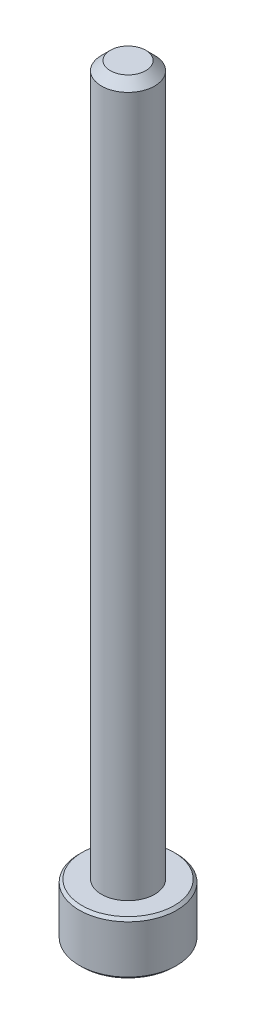
ISO-10303-21;
HEADER;
FILE_DESCRIPTION(('STEP AP214'),'2;1');
FILE_NAME('part.step','',(''),(''),'','','');
FILE_SCHEMA(('AUTOMOTIVE_DESIGN { 1 0 10303 214 1 1 1 1 }'));
ENDSEC;
DATA;
#1=APPLICATION_CONTEXT('core data for automotive mechanical design processes');
#2=APPLICATION_PROTOCOL_DEFINITION('international standard','automotive_design',2000,#1);
#3=PRODUCT_CONTEXT('',#1,'mechanical');
#4=PRODUCT('Part','Part','',(#3));
#5=PRODUCT_RELATED_PRODUCT_CATEGORY('part','',(#4));
#6=PRODUCT_DEFINITION_FORMATION('','',#4);
#7=PRODUCT_DEFINITION_CONTEXT('part definition',#1,'design');
#8=PRODUCT_DEFINITION('design','',#6,#7);
#9=PRODUCT_DEFINITION_SHAPE('','',#8);
#10=(LENGTH_UNIT() NAMED_UNIT(*) SI_UNIT(.MILLI.,.METRE.));
#11=(NAMED_UNIT(*) PLANE_ANGLE_UNIT() SI_UNIT($,.RADIAN.));
#12=(NAMED_UNIT(*) SI_UNIT($,.STERADIAN.) SOLID_ANGLE_UNIT());
#13=UNCERTAINTY_MEASURE_WITH_UNIT(LENGTH_MEASURE(1.E-05),#10,'distance_accuracy_value','');
#14=(GEOMETRIC_REPRESENTATION_CONTEXT(3) GLOBAL_UNCERTAINTY_ASSIGNED_CONTEXT((#13)) GLOBAL_UNIT_ASSIGNED_CONTEXT((#10,
#11,#12)) REPRESENTATION_CONTEXT('',''));
#15=CARTESIAN_POINT('',(0.,0.,0.));
#16=DIRECTION('',(0.,0.,1.));
#17=DIRECTION('',(1.,0.,0.));
#18=AXIS2_PLACEMENT_3D('',#15,#16,#17);
#19=CARTESIAN_POINT('',(9.23760430703373,44.999999906,16.));
#20=DIRECTION('',(0.,-1.,0.));
#21=DIRECTION('',(0.785714285714293,0.,-0.618589574131732));
#22=AXIS2_PLACEMENT_3D('',#19,#20,#21);
#23=CONICAL_SURFACE('',#22,1.,0.785398163397443);
#24=CARTESIAN_POINT('',(9.23760430703373,44.999999906,16.));
#25=DIRECTION('',(0.,1.,0.));
#26=DIRECTION('',(-0.785714285714293,0.,0.618589574131732));
#27=AXIS2_PLACEMENT_3D('',#24,#25,#26);
#28=CIRCLE('',#27,1.);
#29=CARTESIAN_POINT('',(8.45189002131944,44.999999906,16.6185895741317));
#30=VERTEX_POINT('',#29);
#31=EDGE_CURVE('E570',#30,#30,#28,.T.);
#32=ORIENTED_EDGE('',*,*,#31,.F.);
#33=EDGE_LOOP('',(#32));
#34=FACE_BOUND('',#33,.T.);
#35=CARTESIAN_POINT('',(9.23760430703373,44.499999906,16.));
#36=DIRECTION('',(0.,1.,0.));
#37=DIRECTION('',(-0.785714285714293,0.,0.618589574131732));
#38=AXIS2_PLACEMENT_3D('',#35,#36,#37);
#39=CIRCLE('',#38,1.5);
#40=CARTESIAN_POINT('',(8.05903287846229,44.499999906,16.9278843611976));
#41=VERTEX_POINT('',#40);
#42=EDGE_CURVE('E11',#41,#41,#39,.T.);
#43=ORIENTED_EDGE('',*,*,#42,.T.);
#44=EDGE_LOOP('',(#43));
#45=FACE_BOUND('',#44,.T.);
#46=ADVANCED_FACE('F16',(#34,#45),#23,.T.);
#47=CARTESIAN_POINT('',(9.23760430703373,44.999999906,16.));
#48=DIRECTION('',(0.,1.,0.));
#49=DIRECTION('',(-0.785714285714293,0.,0.618589574131732));
#50=AXIS2_PLACEMENT_3D('',#47,#48,#49);
#51=CYLINDRICAL_SURFACE('',#50,1.5);
#52=CARTESIAN_POINT('',(9.23760430703372,4.999999906,16.));
#53=DIRECTION('',(0.,1.,0.));
#54=DIRECTION('',(-0.785714285714293,0.,0.618589574131732));
#55=AXIS2_PLACEMENT_3D('',#52,#53,#54);
#56=CIRCLE('',#55,1.5);
#57=CARTESIAN_POINT('',(8.05903287846228,4.999999906,16.9278843611976));
#58=VERTEX_POINT('',#57);
#59=EDGE_CURVE('E566',#58,#58,#56,.T.);
#60=ORIENTED_EDGE('',*,*,#59,.T.);
#61=EDGE_LOOP('',(#60));
#62=FACE_BOUND('',#61,.T.);
#63=ORIENTED_EDGE('',*,*,#42,.F.);
#64=EDGE_LOOP('',(#63));
#65=FACE_BOUND('',#64,.T.);
#66=ADVANCED_FACE('F220',(#62,#65),#51,.T.);
#67=CARTESIAN_POINT('',(9.23760430703372,4.999999906,16.));
#68=DIRECTION('',(0.,-1.,0.));
#69=DIRECTION('',(0.785714285714293,0.,-0.618589574131732));
#70=AXIS2_PLACEMENT_3D('',#67,#68,#69);
#71=CONICAL_SURFACE('',#70,2.6,0.78539816339746);
#72=CARTESIAN_POINT('',(9.23760430703372,4.999999906,16.));
#73=DIRECTION('',(0.,1.,0.));
#74=DIRECTION('',(-0.785714285714293,0.,0.618589574131732));
#75=AXIS2_PLACEMENT_3D('',#72,#73,#74);
#76=CIRCLE('',#75,2.6);
#77=CARTESIAN_POINT('',(7.19474716417656,4.999999906,17.6083328927425));
#78=VERTEX_POINT('',#77);
#79=EDGE_CURVE('E562',#78,#78,#76,.T.);
#80=ORIENTED_EDGE('',*,*,#79,.F.);
#81=EDGE_LOOP('',(#80));
#82=FACE_BOUND('',#81,.T.);
#83=CARTESIAN_POINT('',(9.23760430703372,4.849999906,16.));
#84=DIRECTION('',(0.,1.,0.));
#85=DIRECTION('',(-0.785714285714293,0.,0.618589574131732));
#86=AXIS2_PLACEMENT_3D('',#83,#84,#85);
#87=CIRCLE('',#86,2.75);
#88=CARTESIAN_POINT('',(7.07689002131942,4.849999906,17.7011213288623));
#89=VERTEX_POINT('',#88);
#90=EDGE_CURVE('E28',#89,#89,#87,.T.);
#91=ORIENTED_EDGE('',*,*,#90,.T.);
#92=EDGE_LOOP('',(#91));
#93=FACE_BOUND('',#92,.T.);
#94=ADVANCED_FACE('F18',(#82,#93),#71,.T.);
#95=CARTESIAN_POINT('',(9.23760430703373,44.999999906,16.));
#96=DIRECTION('',(0.,1.,0.));
#97=DIRECTION('',(-0.785714285714293,0.,0.618589574131732));
#98=AXIS2_PLACEMENT_3D('',#95,#96,#97);
#99=CYLINDRICAL_SURFACE('',#98,2.75);
#100=CARTESIAN_POINT('',(9.23760430703372,2.149999906,16.));
#101=DIRECTION('',(0.,1.,0.));
#102=DIRECTION('',(-0.785714285714293,0.,0.618589574131732));
#103=AXIS2_PLACEMENT_3D('',#100,#101,#102);
#104=CIRCLE('',#103,2.75);
#105=CARTESIAN_POINT('',(7.07689002131942,2.149999906,17.7011213288623));
#106=VERTEX_POINT('',#105);
#107=EDGE_CURVE('E554',#106,#106,#104,.T.);
#108=ORIENTED_EDGE('',*,*,#107,.T.);
#109=EDGE_LOOP('',(#108));
#110=FACE_BOUND('',#109,.T.);
#111=ORIENTED_EDGE('',*,*,#90,.F.);
#112=EDGE_LOOP('',(#111));
#113=FACE_BOUND('',#112,.T.);
#114=ADVANCED_FACE('F224',(#110,#113),#99,.T.);
#115=CARTESIAN_POINT('',(9.23760430703372,2.149999906,16.));
#116=DIRECTION('',(0.,1.,0.));
#117=DIRECTION('',(-0.785714285714293,0.,0.618589574131732));
#118=AXIS2_PLACEMENT_3D('',#115,#116,#117);
#119=CONICAL_SURFACE('',#118,2.75,0.785398163397435);
#120=CARTESIAN_POINT('',(9.23760430703372,1.99999990599999,16.));
#121=DIRECTION('',(0.,1.,0.));
#122=DIRECTION('',(-0.785714285714293,0.,0.618589574131732));
#123=AXIS2_PLACEMENT_3D('',#120,#121,#122);
#124=CIRCLE('',#123,2.6);
#125=CARTESIAN_POINT('',(7.19474716417656,1.999999906,17.6083328927425));
#126=VERTEX_POINT('',#125);
#127=EDGE_CURVE('E558',#126,#126,#124,.T.);
#128=ORIENTED_EDGE('',*,*,#127,.T.);
#129=EDGE_LOOP('',(#128));
#130=FACE_BOUND('',#129,.T.);
#131=ORIENTED_EDGE('',*,*,#107,.F.);
#132=EDGE_LOOP('',(#131));
#133=FACE_BOUND('',#132,.T.);
#134=ADVANCED_FACE('F222',(#130,#133),#119,.T.);
#135=CARTESIAN_POINT('',(10.8459371997762,1.99999990599999,18.0428571428571));
#136=DIRECTION('',(0.,-1.,0.));
#137=DIRECTION('',(-1.,0.,0.));
#138=AXIS2_PLACEMENT_3D('',#135,#136,#137);
#139=PLANE('',#138);
#140=CARTESIAN_POINT('',(9.23760430703372,1.99999990599999,16.));
#141=DIRECTION('',(0.,-1.,0.));
#142=DIRECTION('',(0.785714285714293,0.,-0.618589574131732));
#143=AXIS2_PLACEMENT_3D('',#140,#141,#142);
#144=CIRCLE('',#143,1.44337567297406);
#145=CARTESIAN_POINT('',(10.3716851929419,1.99999990599999,15.1071428571429));
#146=VERTEX_POINT('',#145);
#147=CARTESIAN_POINT('',(10.5778817176525,1.99999990599999,16.5357142857143));
#148=VERTEX_POINT('',#147);
#149=EDGE_CURVE('E317',#146,#148,#144,.T.);
#150=ORIENTED_EDGE('',*,*,#149,.F.);
#151=CARTESIAN_POINT('',(9.23760430703372,1.99999990599999,16.));
#152=DIRECTION('',(0.,-1.,0.));
#153=DIRECTION('',(0.785714285714293,0.,-0.618589574131732));
#154=AXIS2_PLACEMENT_3D('',#151,#152,#153);
#155=CIRCLE('',#154,1.44337567297406);
#156=CARTESIAN_POINT('',(9.03140778232316,1.99999990599999,14.5714285714286));
#157=VERTEX_POINT('',#156);
#158=EDGE_CURVE('E133',#157,#146,#155,.T.);
#159=ORIENTED_EDGE('',*,*,#158,.F.);
#160=CARTESIAN_POINT('',(9.23760430703372,1.99999990599999,16.));
#161=DIRECTION('',(0.,-1.,0.));
#162=DIRECTION('',(0.785714285714293,0.,-0.618589574131732));
#163=AXIS2_PLACEMENT_3D('',#160,#161,#162);
#164=CIRCLE('',#163,1.44337567297406);
#165=CARTESIAN_POINT('',(7.89732689641495,1.99999990599999,15.4642857142857));
#166=VERTEX_POINT('',#165);
#167=EDGE_CURVE('E127',#166,#157,#164,.T.);
#168=ORIENTED_EDGE('',*,*,#167,.F.);
#169=CARTESIAN_POINT('',(9.23760430703372,1.99999990599999,16.));
#170=DIRECTION('',(0.,-1.,0.));
#171=DIRECTION('',(0.785714285714293,0.,-0.618589574131732));
#172=AXIS2_PLACEMENT_3D('',#169,#170,#171);
#173=CIRCLE('',#172,1.44337567297406);
#174=CARTESIAN_POINT('',(8.10352342112552,1.99999990599999,16.8928571428571));
#175=VERTEX_POINT('',#174);
#176=EDGE_CURVE('E115',#175,#166,#173,.T.);
#177=ORIENTED_EDGE('',*,*,#176,.F.);
#178=CARTESIAN_POINT('',(9.23760430703372,1.99999990599999,16.));
#179=DIRECTION('',(0.,-1.,0.));
#180=DIRECTION('',(0.785714285714293,0.,-0.618589574131732));
#181=AXIS2_PLACEMENT_3D('',#178,#179,#180);
#182=CIRCLE('',#181,1.44337567297406);
#183=CARTESIAN_POINT('',(9.44380083174429,1.99999990599999,17.4285714285714));
#184=VERTEX_POINT('',#183);
#185=EDGE_CURVE('E126',#184,#175,#182,.T.);
#186=ORIENTED_EDGE('',*,*,#185,.F.);
#187=CARTESIAN_POINT('',(9.23760430703372,1.99999990599999,16.));
#188=DIRECTION('',(0.,-1.,0.));
#189=DIRECTION('',(0.785714285714293,0.,-0.618589574131732));
#190=AXIS2_PLACEMENT_3D('',#187,#188,#189);
#191=CIRCLE('',#190,1.44337567297406);
#192=EDGE_CURVE('E340',#148,#184,#191,.T.);
#193=ORIENTED_EDGE('',*,*,#192,.F.);
#194=EDGE_LOOP('',(#150,#159,#168,#177,#186,#193));
#195=FACE_BOUND('',#194,.T.);
#196=ORIENTED_EDGE('',*,*,#127,.F.);
#197=EDGE_LOOP('',(#196));
#198=FACE_BOUND('',#197,.T.);
#199=ADVANCED_FACE('F131',(#195,#198),#139,.T.);
#200=CARTESIAN_POINT('',(10.8459371997762,4.999999906,18.0428571428571));
#201=DIRECTION('',(0.,1.,0.));
#202=DIRECTION('',(1.,0.,0.));
#203=AXIS2_PLACEMENT_3D('',#200,#201,#202);
#204=PLANE('',#203);
#205=ORIENTED_EDGE('',*,*,#79,.T.);
#206=EDGE_LOOP('',(#205));
#207=FACE_BOUND('',#206,.T.);
#208=ORIENTED_EDGE('',*,*,#59,.F.);
#209=EDGE_LOOP('',(#208));
#210=FACE_BOUND('',#209,.T.);
#211=ADVANCED_FACE('F253',(#207,#210),#204,.T.);
#212=CARTESIAN_POINT('',(9.85619388116546,44.999999906,16.7857142857143));
#213=DIRECTION('',(0.,1.,0.));
#214=DIRECTION('',(1.,0.,0.));
#215=AXIS2_PLACEMENT_3D('',#212,#213,#214);
#216=PLANE('',#215);
#217=ORIENTED_EDGE('',*,*,#31,.T.);
#218=EDGE_LOOP('',(#217));
#219=FACE_BOUND('',#218,.T.);
#220=ADVANCED_FACE('F256',(#219),#216,.T.);
#221=CARTESIAN_POINT('',(9.23760430703372,1.99999990599999,16.));
#222=DIRECTION('',(0.,-1.,0.));
#223=DIRECTION('',(0.785714285714293,0.,-0.618589574131732));
#224=AXIS2_PLACEMENT_3D('',#221,#222,#223);
#225=CONICAL_SURFACE('',#224,1.44337567297406,0.78539816339745);
#226=ORIENTED_EDGE('',*,*,#192,.T.);
#227=CARTESIAN_POINT('',(10.5778817176525,1.99999990599999,16.5357142857143));
#228=CARTESIAN_POINT('',(10.2745979971004,2.19299863726044,16.774488291671));
#229=CARTESIAN_POINT('',(10.0129284441921,2.19337275639812,16.9804996373215));
#230=CARTESIAN_POINT('',(9.74826707710684,2.19375115304891,17.1888664257725));
#231=CARTESIAN_POINT('',(9.4438008317443,1.99999990599999,17.4285714285714));
#232=B_SPLINE_CURVE_WITH_KNOTS('',2,(#227,#228,#229,#230,#231),.UNSPECIFIED.,.F.,.F.,(3,2,3),
(0.,0.5,1.),.UNSPECIFIED.);
#233=EDGE_CURVE('E586',#148,#184,#232,.T.);
#234=ORIENTED_EDGE('',*,*,#233,.F.);
#235=EDGE_LOOP('',(#226,#234));
#236=FACE_BOUND('',#235,.T.);
#237=ADVANCED_FACE('F244',(#236),#225,.F.);
#238=CARTESIAN_POINT('',(9.23760430703372,1.99999990599999,16.));
#239=DIRECTION('',(0.,-1.,0.));
#240=DIRECTION('',(0.785714285714293,0.,-0.618589574131732));
#241=AXIS2_PLACEMENT_3D('',#238,#239,#240);
#242=CONICAL_SURFACE('',#241,1.44337567297406,0.78539816339745);
#243=ORIENTED_EDGE('',*,*,#185,.T.);
#244=CARTESIAN_POINT('',(9.44380083174428,1.99999990599999,17.4285714285714));
#245=CARTESIAN_POINT('',(9.08537461654586,2.19299863726071,17.2853070249972));
#246=CARTESIAN_POINT('',(8.77612878129111,2.19337275639811,17.1617002176071));
#247=CARTESIAN_POINT('',(8.46334716564438,2.19375115304862,17.0366801445363));
#248=CARTESIAN_POINT('',(8.10352342112552,1.99999990599999,16.8928571428571));
#249=B_SPLINE_CURVE_WITH_KNOTS('',2,(#244,#245,#246,#247,#248),.UNSPECIFIED.,.F.,.F.,(3,2,3),
(0.,0.5,1.),.UNSPECIFIED.);
#250=EDGE_CURVE('E346',#184,#175,#249,.T.);
#251=ORIENTED_EDGE('',*,*,#250,.F.);
#252=EDGE_LOOP('',(#243,#251));
#253=FACE_BOUND('',#252,.T.);
#254=ADVANCED_FACE('F219',(#253),#242,.F.);
#255=CARTESIAN_POINT('',(9.23760430703372,1.99999990599999,16.));
#256=DIRECTION('',(0.,-1.,0.));
#257=DIRECTION('',(0.785714285714293,0.,-0.618589574131732));
#258=AXIS2_PLACEMENT_3D('',#255,#256,#257);
#259=CONICAL_SURFACE('',#258,1.44337567297406,0.78539816339745);
#260=ORIENTED_EDGE('',*,*,#176,.T.);
#261=CARTESIAN_POINT('',(8.10352342112552,1.99999990599999,16.8928571428571));
#262=CARTESIAN_POINT('',(8.04838092647953,2.192998637261,16.5108187333253));
#263=CARTESIAN_POINT('',(8.00080464413273,2.19337275639813,16.1812005802857));
#264=CARTESIAN_POINT('',(7.95268439557162,2.19375115304835,15.8478137187629));
#265=CARTESIAN_POINT('',(7.89732689641496,1.99999990599999,15.4642857142857));
#266=B_SPLINE_CURVE_WITH_KNOTS('',2,(#261,#262,#263,#264,#265),.UNSPECIFIED.,.F.,.F.,(3,2,3),
(0.,0.5,1.),.UNSPECIFIED.);
#267=EDGE_CURVE('E119',#175,#166,#266,.T.);
#268=ORIENTED_EDGE('',*,*,#267,.F.);
#269=EDGE_LOOP('',(#260,#268));
#270=FACE_BOUND('',#269,.T.);
#271=ADVANCED_FACE('F117',(#270),#259,.F.);
#272=CARTESIAN_POINT('',(9.23760430703372,1.99999990599999,16.));
#273=DIRECTION('',(0.,-1.,0.));
#274=DIRECTION('',(0.785714285714293,0.,-0.618589574131732));
#275=AXIS2_PLACEMENT_3D('',#272,#273,#274);
#276=CONICAL_SURFACE('',#275,1.44337567297406,0.78539816339745);
#277=ORIENTED_EDGE('',*,*,#167,.T.);
#278=CARTESIAN_POINT('',(7.89732689641495,1.999999906,15.4642857142857));
#279=CARTESIAN_POINT('',(8.20061061696754,2.19299863726072,15.2255117083286));
#280=CARTESIAN_POINT('',(8.46228016987534,2.19337275639814,15.0195003626785));
#281=CARTESIAN_POINT('',(8.72694153696104,2.19375115304864,14.8111335742272));
#282=CARTESIAN_POINT('',(9.03140778232314,1.999999906,14.5714285714286));
#283=B_SPLINE_CURVE_WITH_KNOTS('',2,(#278,#279,#280,#281,#282),.UNSPECIFIED.,.F.,.F.,(3,2,3),
(0.,0.5,1.),.UNSPECIFIED.);
#284=EDGE_CURVE('E152',#166,#157,#283,.T.);
#285=ORIENTED_EDGE('',*,*,#284,.F.);
#286=EDGE_LOOP('',(#277,#285));
#287=FACE_BOUND('',#286,.T.);
#288=ADVANCED_FACE('F154',(#287),#276,.F.);
#289=CARTESIAN_POINT('',(9.23760430703372,1.99999990599999,16.));
#290=DIRECTION('',(0.,-1.,0.));
#291=DIRECTION('',(0.785714285714293,0.,-0.618589574131732));
#292=AXIS2_PLACEMENT_3D('',#289,#290,#291);
#293=CONICAL_SURFACE('',#292,1.44337567297406,0.78539816339745);
#294=ORIENTED_EDGE('',*,*,#158,.T.);
#295=CARTESIAN_POINT('',(9.03140778232316,1.99999990599999,14.5714285714286));
#296=CARTESIAN_POINT('',(9.38983399752165,2.19299863726073,14.7146929750029));
#297=CARTESIAN_POINT('',(9.69907983277633,2.19337275639814,14.8382997823929));
#298=CARTESIAN_POINT('',(10.011861448423,2.19375115304864,14.9633198554637));
#299=CARTESIAN_POINT('',(10.3716851929419,1.99999990599999,15.1071428571429));
#300=B_SPLINE_CURVE_WITH_KNOTS('',2,(#295,#296,#297,#298,#299),.UNSPECIFIED.,.F.,.F.,(3,2,3),
(0.,0.5,1.),.UNSPECIFIED.);
#301=EDGE_CURVE('E172',#157,#146,#300,.T.);
#302=ORIENTED_EDGE('',*,*,#301,.F.);
#303=EDGE_LOOP('',(#294,#302));
#304=FACE_BOUND('',#303,.T.);
#305=ADVANCED_FACE('F263',(#304),#293,.F.);
#306=CARTESIAN_POINT('',(9.23760430703372,1.99999990599999,16.));
#307=DIRECTION('',(0.,-1.,0.));
#308=DIRECTION('',(0.785714285714293,0.,-0.618589574131732));
#309=AXIS2_PLACEMENT_3D('',#306,#307,#308);
#310=CONICAL_SURFACE('',#309,1.44337567297406,0.78539816339745);
#311=ORIENTED_EDGE('',*,*,#149,.T.);
#312=CARTESIAN_POINT('',(10.3716851929419,1.99999990599999,15.1071428571429));
#313=CARTESIAN_POINT('',(10.4268276875877,2.19299863726046,15.4891812666737));
#314=CARTESIAN_POINT('',(10.4744039699347,2.19337275639814,15.8187994197143));
#315=CARTESIAN_POINT('',(10.5225242184956,2.19375115304892,16.152186281236));
#316=CARTESIAN_POINT('',(10.5778817176525,1.99999990599999,16.5357142857143));
#317=B_SPLINE_CURVE_WITH_KNOTS('',2,(#312,#313,#314,#315,#316),.UNSPECIFIED.,.F.,.F.,(3,2,3),
(0.,0.5,1.),.UNSPECIFIED.);
#318=EDGE_CURVE('E284',#146,#148,#317,.T.);
#319=ORIENTED_EDGE('',*,*,#318,.F.);
#320=EDGE_LOOP('',(#311,#319));
#321=FACE_BOUND('',#320,.T.);
#322=ADVANCED_FACE('F251',(#321),#310,.F.);
#323=CARTESIAN_POINT('',(10.8459371997762,3.499999906,18.0428571428571));
#324=DIRECTION('',(0.,-1.,0.));
#325=DIRECTION('',(-1.,0.,0.));
#326=AXIS2_PLACEMENT_3D('',#323,#324,#325);
#327=PLANE('',#326);
#328=DIRECTION('',(-0.142857142857131,0.,-0.989743318610789));
#329=VECTOR('',#328,1.);
#330=CARTESIAN_POINT('',(10.3716851929419,3.499999906,15.1071428571429));
#331=LINE('',#330,#329);
#332=CARTESIAN_POINT('',(10.5778817176525,3.499999906,16.5357142857143));
#333=VERTEX_POINT('',#332);
#334=CARTESIAN_POINT('',(10.3716851929419,3.499999906,15.1071428571429));
#335=VERTEX_POINT('',#334);
#336=EDGE_CURVE('E309',#333,#335,#331,.T.);
#337=ORIENTED_EDGE('',*,*,#336,.F.);
#338=DIRECTION('',(0.785714285714293,0.,-0.618589574131732));
#339=VECTOR('',#338,1.);
#340=CARTESIAN_POINT('',(10.5778817176525,3.499999906,16.5357142857143));
#341=LINE('',#340,#339);
#342=CARTESIAN_POINT('',(9.44380083174428,3.499999906,17.4285714285714));
#343=VERTEX_POINT('',#342);
#344=EDGE_CURVE('E583',#343,#333,#341,.T.);
#345=ORIENTED_EDGE('',*,*,#344,.F.);
#346=DIRECTION('',(0.928571428571424,0.,0.371153744479057));
#347=VECTOR('',#346,1.);
#348=CARTESIAN_POINT('',(9.44380083174428,3.499999906,17.4285714285714));
#349=LINE('',#348,#347);
#350=CARTESIAN_POINT('',(8.10352342112552,3.499999906,16.8928571428571));
#351=VERTEX_POINT('',#350);
#352=EDGE_CURVE('E590',#351,#343,#349,.T.);
#353=ORIENTED_EDGE('',*,*,#352,.F.);
#354=DIRECTION('',(0.142857142857131,0.,0.989743318610789));
#355=VECTOR('',#354,1.);
#356=CARTESIAN_POINT('',(8.10352342112552,3.499999906,16.8928571428571));
#357=LINE('',#356,#355);
#358=CARTESIAN_POINT('',(7.89732689641495,3.499999906,15.4642857142857));
#359=VERTEX_POINT('',#358);
#360=EDGE_CURVE('E149',#359,#351,#357,.T.);
#361=ORIENTED_EDGE('',*,*,#360,.F.);
#362=DIRECTION('',(-0.785714285714293,0.,0.618589574131732));
#363=VECTOR('',#362,1.);
#364=CARTESIAN_POINT('',(7.89732689641495,3.499999906,15.4642857142857));
#365=LINE('',#364,#363);
#366=CARTESIAN_POINT('',(9.03140778232316,3.499999906,14.5714285714286));
#367=VERTEX_POINT('',#366);
#368=EDGE_CURVE('E160',#367,#359,#365,.T.);
#369=ORIENTED_EDGE('',*,*,#368,.F.);
#370=DIRECTION('',(-0.928571428571424,0.,-0.371153744479057));
#371=VECTOR('',#370,1.);
#372=CARTESIAN_POINT('',(9.03140778232316,3.499999906,14.5714285714286));
#373=LINE('',#372,#371);
#374=EDGE_CURVE('E166',#335,#367,#373,.T.);
#375=ORIENTED_EDGE('',*,*,#374,.F.);
#376=EDGE_LOOP('',(#337,#345,#353,#361,#369,#375));
#377=FACE_BOUND('',#376,.T.);
#378=ADVANCED_FACE('F247',(#377),#327,.T.);
#379=CARTESIAN_POINT('',(10.5778817176525,8.81881298512988,16.5357142857143));
#380=DIRECTION('',(0.618589574131732,0.,0.785714285714293));
#381=DIRECTION('',(0.,-1.,0.));
#382=AXIS2_PLACEMENT_3D('',#379,#380,#381);
#383=PLANE('',#382);
#384=DIRECTION('',(0.,-1.,0.));
#385=VECTOR('',#384,1.);
#386=CARTESIAN_POINT('',(10.5778817176525,8.81881298512988,16.5357142857143));
#387=LINE('',#386,#385);
#388=EDGE_CURVE('E320',#333,#148,#387,.T.);
#389=ORIENTED_EDGE('',*,*,#388,.T.);
#390=ORIENTED_EDGE('',*,*,#233,.T.);
#391=DIRECTION('',(0.,-1.,0.));
#392=VECTOR('',#391,1.);
#393=CARTESIAN_POINT('',(9.44380083174429,8.81881298512988,17.4285714285714));
#394=LINE('',#393,#392);
#395=EDGE_CURVE('E343',#343,#184,#394,.T.);
#396=ORIENTED_EDGE('',*,*,#395,.F.);
#397=ORIENTED_EDGE('',*,*,#344,.T.);
#398=EDGE_LOOP('',(#389,#390,#396,#397));
#399=FACE_BOUND('',#398,.T.);
#400=ADVANCED_FACE('F250',(#399),#383,.F.);
#401=CARTESIAN_POINT('',(9.44380083174429,8.81881298512988,17.4285714285714));
#402=DIRECTION('',(-0.371153744479057,0.,0.928571428571424));
#403=DIRECTION('',(0.,1.,0.));
#404=AXIS2_PLACEMENT_3D('',#401,#402,#403);
#405=PLANE('',#404);
#406=ORIENTED_EDGE('',*,*,#395,.T.);
#407=ORIENTED_EDGE('',*,*,#250,.T.);
#408=DIRECTION('',(0.,-1.,0.));
#409=VECTOR('',#408,1.);
#410=CARTESIAN_POINT('',(8.10352342112552,8.81881298512988,16.8928571428571));
#411=LINE('',#410,#409);
#412=EDGE_CURVE('E147',#351,#175,#411,.T.);
#413=ORIENTED_EDGE('',*,*,#412,.F.);
#414=ORIENTED_EDGE('',*,*,#352,.T.);
#415=EDGE_LOOP('',(#406,#407,#413,#414));
#416=FACE_BOUND('',#415,.T.);
#417=ADVANCED_FACE('F196',(#416),#405,.F.);
#418=CARTESIAN_POINT('',(8.10352342112552,8.81881298512988,16.8928571428571));
#419=DIRECTION('',(-0.989743318610789,0.,0.142857142857131));
#420=DIRECTION('',(0.,1.,0.));
#421=AXIS2_PLACEMENT_3D('',#418,#419,#420);
#422=PLANE('',#421);
#423=ORIENTED_EDGE('',*,*,#412,.T.);
#424=ORIENTED_EDGE('',*,*,#267,.T.);
#425=DIRECTION('',(0.,-1.,0.));
#426=VECTOR('',#425,1.);
#427=CARTESIAN_POINT('',(7.89732689641495,8.81881298512988,15.4642857142857));
#428=LINE('',#427,#426);
#429=EDGE_CURVE('E145',#359,#166,#428,.T.);
#430=ORIENTED_EDGE('',*,*,#429,.F.);
#431=ORIENTED_EDGE('',*,*,#360,.T.);
#432=EDGE_LOOP('',(#423,#424,#430,#431));
#433=FACE_BOUND('',#432,.T.);
#434=ADVANCED_FACE('F142',(#433),#422,.F.);
#435=CARTESIAN_POINT('',(7.89732689641495,8.81881298512988,15.4642857142857));
#436=DIRECTION('',(-0.618589574131732,0.,-0.785714285714293));
#437=DIRECTION('',(-0.785714285714293,0.,0.618589574131732));
#438=AXIS2_PLACEMENT_3D('',#435,#436,#437);
#439=PLANE('',#438);
#440=ORIENTED_EDGE('',*,*,#429,.T.);
#441=ORIENTED_EDGE('',*,*,#284,.T.);
#442=DIRECTION('',(0.,-1.,0.));
#443=VECTOR('',#442,1.);
#444=CARTESIAN_POINT('',(9.03140778232316,8.81881298512988,14.5714285714286));
#445=LINE('',#444,#443);
#446=EDGE_CURVE('E313',#367,#157,#445,.T.);
#447=ORIENTED_EDGE('',*,*,#446,.F.);
#448=ORIENTED_EDGE('',*,*,#368,.T.);
#449=EDGE_LOOP('',(#440,#441,#447,#448));
#450=FACE_BOUND('',#449,.T.);
#451=ADVANCED_FACE('F164',(#450),#439,.F.);
#452=CARTESIAN_POINT('',(9.03140778232316,8.81881298512988,14.5714285714286));
#453=DIRECTION('',(0.371153744479057,0.,-0.928571428571424));
#454=DIRECTION('',(0.,-1.,0.));
#455=AXIS2_PLACEMENT_3D('',#452,#453,#454);
#456=PLANE('',#455);
#457=ORIENTED_EDGE('',*,*,#446,.T.);
#458=ORIENTED_EDGE('',*,*,#301,.T.);
#459=DIRECTION('',(0.,-1.,0.));
#460=VECTOR('',#459,1.);
#461=CARTESIAN_POINT('',(10.3716851929419,8.81881298512988,15.1071428571429));
#462=LINE('',#461,#460);
#463=EDGE_CURVE('E275',#335,#146,#462,.T.);
#464=ORIENTED_EDGE('',*,*,#463,.F.);
#465=ORIENTED_EDGE('',*,*,#374,.T.);
#466=EDGE_LOOP('',(#457,#458,#464,#465));
#467=FACE_BOUND('',#466,.T.);
#468=ADVANCED_FACE('F190',(#467),#456,.F.);
#469=CARTESIAN_POINT('',(10.3716851929419,8.81881298512988,15.1071428571429));
#470=DIRECTION('',(0.989743318610789,0.,-0.142857142857131));
#471=DIRECTION('',(0.,-1.,0.));
#472=AXIS2_PLACEMENT_3D('',#469,#470,#471);
#473=PLANE('',#472);
#474=ORIENTED_EDGE('',*,*,#463,.T.);
#475=ORIENTED_EDGE('',*,*,#318,.T.);
#476=ORIENTED_EDGE('',*,*,#388,.F.);
#477=ORIENTED_EDGE('',*,*,#336,.T.);
#478=EDGE_LOOP('',(#474,#475,#476,#477));
#479=FACE_BOUND('',#478,.T.);
#480=ADVANCED_FACE('F294',(#479),#473,.F.);
#481=CLOSED_SHELL('',(#46,#66,#94,#114,#134,#199,#211,#220,#237,#254,#271,#288,#305,#322,#378,
#400,#417,#434,#451,#468,#480));
#482=MANIFOLD_SOLID_BREP('B1',#481);
#483=ADVANCED_BREP_SHAPE_REPRESENTATION('',(#18,#482),#14);
#484=SHAPE_DEFINITION_REPRESENTATION(#9,#483);
ENDSEC;
END-ISO-10303-21;
